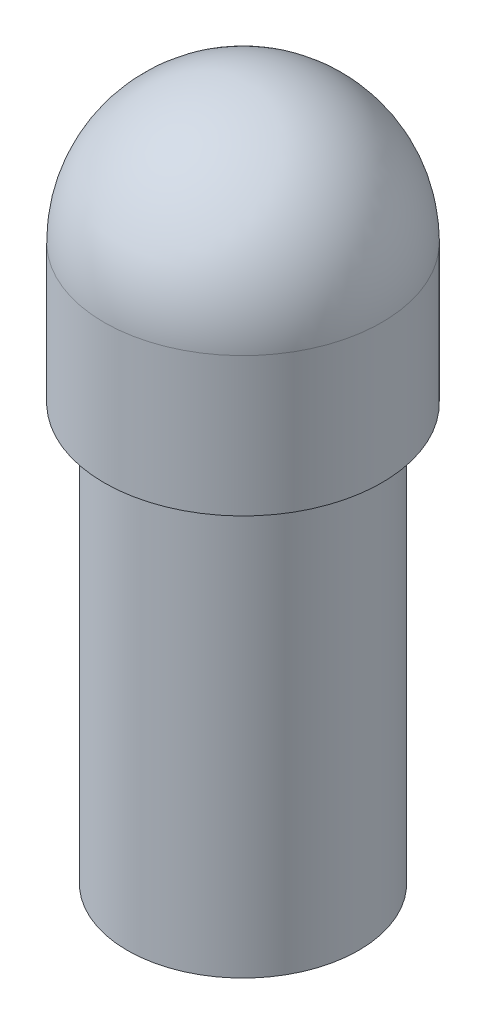
ISO-10303-21;
HEADER;
FILE_DESCRIPTION(('STEP AP214'),'2;1');
FILE_NAME('part.step','',(''),(''),'','','');
FILE_SCHEMA(('AUTOMOTIVE_DESIGN { 1 0 10303 214 1 1 1 1 }'));
ENDSEC;
DATA;
#1=APPLICATION_CONTEXT('core data for automotive mechanical design processes');
#2=APPLICATION_PROTOCOL_DEFINITION('international standard','automotive_design',2000,#1);
#3=PRODUCT_CONTEXT('',#1,'mechanical');
#4=PRODUCT('Part','Part','',(#3));
#5=PRODUCT_RELATED_PRODUCT_CATEGORY('part','',(#4));
#6=PRODUCT_DEFINITION_FORMATION('','',#4);
#7=PRODUCT_DEFINITION_CONTEXT('part definition',#1,'design');
#8=PRODUCT_DEFINITION('design','',#6,#7);
#9=PRODUCT_DEFINITION_SHAPE('','',#8);
#10=(LENGTH_UNIT() NAMED_UNIT(*) SI_UNIT(.MILLI.,.METRE.));
#11=(NAMED_UNIT(*) PLANE_ANGLE_UNIT() SI_UNIT($,.RADIAN.));
#12=(NAMED_UNIT(*) SI_UNIT($,.STERADIAN.) SOLID_ANGLE_UNIT());
#13=UNCERTAINTY_MEASURE_WITH_UNIT(LENGTH_MEASURE(1.E-05),#10,'distance_accuracy_value','');
#14=(GEOMETRIC_REPRESENTATION_CONTEXT(3) GLOBAL_UNCERTAINTY_ASSIGNED_CONTEXT((#13)) GLOBAL_UNIT_ASSIGNED_CONTEXT((#10,
#11,#12)) REPRESENTATION_CONTEXT('',''));
#15=CARTESIAN_POINT('',(0.,0.,0.));
#16=DIRECTION('',(0.,0.,1.));
#17=DIRECTION('',(1.,0.,0.));
#18=AXIS2_PLACEMENT_3D('',#15,#16,#17);
#19=CARTESIAN_POINT('',(0.,18.,0.));
#20=DIRECTION('',(0.,-1.,0.));
#21=DIRECTION('',(0.,0.,-1.));
#22=AXIS2_PLACEMENT_3D('',#19,#20,#21);
#23=CYLINDRICAL_SURFACE('',#22,5.);
#24=CARTESIAN_POINT('',(0.,18.,0.));
#25=DIRECTION('',(0.,1.,0.));
#26=DIRECTION('',(0.,0.,1.));
#27=AXIS2_PLACEMENT_3D('',#24,#25,#26);
#28=CIRCLE('',#27,5.);
#29=CARTESIAN_POINT('',(0.,18.,5.));
#30=VERTEX_POINT('',#29);
#31=EDGE_CURVE('E42',#30,#30,#28,.T.);
#32=ORIENTED_EDGE('',*,*,#31,.F.);
#33=EDGE_LOOP('',(#32));
#34=FACE_BOUND('',#33,.T.);
#35=CARTESIAN_POINT('',(0.,0.,0.));
#36=DIRECTION('',(0.,1.,0.));
#37=DIRECTION('',(0.,0.,1.));
#38=AXIS2_PLACEMENT_3D('',#35,#36,#37);
#39=CIRCLE('',#38,5.);
#40=CARTESIAN_POINT('',(0.,0.,5.));
#41=VERTEX_POINT('',#40);
#42=EDGE_CURVE('E46',#41,#41,#39,.T.);
#43=ORIENTED_EDGE('',*,*,#42,.T.);
#44=EDGE_LOOP('',(#43));
#45=FACE_BOUND('',#44,.T.);
#46=ADVANCED_FACE('F35',(#34,#45),#23,.T.);
#47=CARTESIAN_POINT('',(0.,0.,0.));
#48=DIRECTION('',(0.,1.,0.));
#49=DIRECTION('',(0.,0.,1.));
#50=AXIS2_PLACEMENT_3D('',#47,#48,#49);
#51=PLANE('',#50);
#52=ORIENTED_EDGE('',*,*,#42,.F.);
#53=EDGE_LOOP('',(#52));
#54=FACE_BOUND('',#53,.T.);
#55=ADVANCED_FACE('F60',(#54),#51,.F.);
#56=CARTESIAN_POINT('',(0.,18.,0.));
#57=DIRECTION('',(0.,1.,0.));
#58=DIRECTION('',(0.,0.,1.));
#59=AXIS2_PLACEMENT_3D('',#56,#57,#58);
#60=PLANE('',#59);
#61=CARTESIAN_POINT('',(0.,18.,0.));
#62=DIRECTION('',(0.,1.,0.));
#63=DIRECTION('',(0.,0.,1.));
#64=AXIS2_PLACEMENT_3D('',#61,#62,#63);
#65=CIRCLE('',#64,6.);
#66=CARTESIAN_POINT('',(0.,18.,6.));
#67=VERTEX_POINT('',#66);
#68=EDGE_CURVE('E51',#67,#67,#65,.T.);
#69=ORIENTED_EDGE('',*,*,#68,.F.);
#70=EDGE_LOOP('',(#69));
#71=FACE_BOUND('',#70,.T.);
#72=ORIENTED_EDGE('',*,*,#31,.T.);
#73=EDGE_LOOP('',(#72));
#74=FACE_BOUND('',#73,.T.);
#75=ADVANCED_FACE('F58',(#71,#74),#60,.F.);
#76=CARTESIAN_POINT('',(0.,30.,0.));
#77=DIRECTION('',(0.,-1.,0.));
#78=DIRECTION('',(0.,0.,-1.));
#79=AXIS2_PLACEMENT_3D('',#76,#77,#78);
#80=CYLINDRICAL_SURFACE('',#79,6.);
#81=CARTESIAN_POINT('',(0.,24.,0.));
#82=DIRECTION('',(0.,-1.,0.));
#83=DIRECTION('',(0.,0.,-1.));
#84=AXIS2_PLACEMENT_3D('',#81,#82,#83);
#85=CIRCLE('',#84,6.);
#86=CARTESIAN_POINT('',(0.,24.,-6.));
#87=VERTEX_POINT('',#86);
#88=EDGE_CURVE('E10',#87,#87,#85,.T.);
#89=ORIENTED_EDGE('',*,*,#88,.T.);
#90=EDGE_LOOP('',(#89));
#91=FACE_BOUND('',#90,.T.);
#92=ORIENTED_EDGE('',*,*,#68,.T.);
#93=EDGE_LOOP('',(#92));
#94=FACE_BOUND('',#93,.T.);
#95=ADVANCED_FACE('F56',(#91,#94),#80,.T.);
#96=CARTESIAN_POINT('',(0.,24.,0.));
#97=DIRECTION('',(0.,0.,1.));
#98=DIRECTION('',(1.,0.,0.));
#99=AXIS2_PLACEMENT_3D('',#96,#97,#98);
#100=SPHERICAL_SURFACE('',#99,6.);
#101=CARTESIAN_POINT('',(0.,24.,0.));
#102=DIRECTION('',(0.,-1.,0.));
#103=DIRECTION('',(0.,0.,-1.));
#104=AXIS2_PLACEMENT_3D('',#101,#102,#103);
#105=SPHERICAL_SURFACE('',#104,6.);
#106=ORIENTED_EDGE('',*,*,#88,.F.);
#107=EDGE_LOOP('',(#106));
#108=FACE_BOUND('',#107,.T.);
#109=ADVANCED_FACE('F37',(#108),#105,.T.);
#110=CLOSED_SHELL('',(#46,#55,#75,#95,#109));
#111=MANIFOLD_SOLID_BREP('B2',#110);
#112=ADVANCED_BREP_SHAPE_REPRESENTATION('',(#18,#111),#14);
#113=SHAPE_DEFINITION_REPRESENTATION(#9,#112);
ENDSEC;
END-ISO-10303-21;
